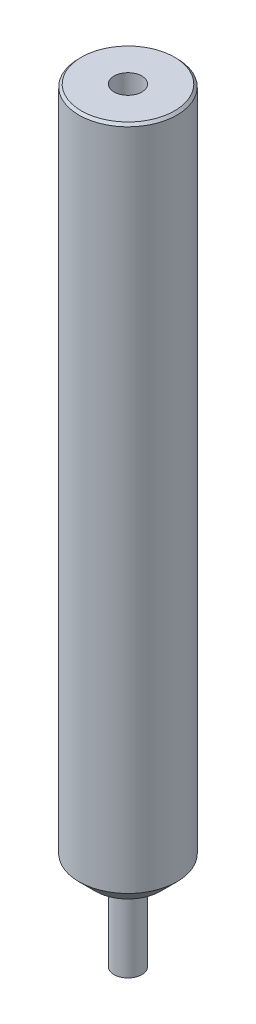
ISO-10303-21;
HEADER;
FILE_DESCRIPTION(('STEP AP214'),'2;1');
FILE_NAME('part.step','',(''),(''),'','','');
FILE_SCHEMA(('AUTOMOTIVE_DESIGN { 1 0 10303 214 1 1 1 1 }'));
ENDSEC;
DATA;
#1=APPLICATION_CONTEXT('core data for automotive mechanical design processes');
#2=APPLICATION_PROTOCOL_DEFINITION('international standard','automotive_design',2000,#1);
#3=PRODUCT_CONTEXT('',#1,'mechanical');
#4=PRODUCT('Part','Part','',(#3));
#5=PRODUCT_RELATED_PRODUCT_CATEGORY('part','',(#4));
#6=PRODUCT_DEFINITION_FORMATION('','',#4);
#7=PRODUCT_DEFINITION_CONTEXT('part definition',#1,'design');
#8=PRODUCT_DEFINITION('design','',#6,#7);
#9=PRODUCT_DEFINITION_SHAPE('','',#8);
#10=(LENGTH_UNIT() NAMED_UNIT(*) SI_UNIT(.MILLI.,.METRE.));
#11=(NAMED_UNIT(*) PLANE_ANGLE_UNIT() SI_UNIT($,.RADIAN.));
#12=(NAMED_UNIT(*) SI_UNIT($,.STERADIAN.) SOLID_ANGLE_UNIT());
#13=UNCERTAINTY_MEASURE_WITH_UNIT(LENGTH_MEASURE(1.E-05),#10,'distance_accuracy_value','');
#14=(GEOMETRIC_REPRESENTATION_CONTEXT(3) GLOBAL_UNCERTAINTY_ASSIGNED_CONTEXT((#13)) GLOBAL_UNIT_ASSIGNED_CONTEXT((#10,
#11,#12)) REPRESENTATION_CONTEXT('',''));
#15=CARTESIAN_POINT('',(0.,0.,0.));
#16=DIRECTION('',(0.,0.,1.));
#17=DIRECTION('',(1.,0.,0.));
#18=AXIS2_PLACEMENT_3D('',#15,#16,#17);
#19=CARTESIAN_POINT('',(4.27446189366745E-11,5.00249648859584E-12,0.));
#20=DIRECTION('',(0.,1.,0.));
#21=DIRECTION('',(0.,0.,1.));
#22=AXIS2_PLACEMENT_3D('',#19,#20,#21);
#23=CYLINDRICAL_SURFACE('',#22,1.7);
#24=CARTESIAN_POINT('',(4.27446189366745E-11,5.00249648859584E-12,0.));
#25=DIRECTION('',(0.,1.,0.));
#26=DIRECTION('',(0.,0.,1.));
#27=AXIS2_PLACEMENT_3D('',#24,#25,#26);
#28=CIRCLE('',#27,1.7);
#29=CARTESIAN_POINT('',(4.27446189366745E-11,5.00249648859584E-12,1.7));
#30=VERTEX_POINT('',#29);
#31=EDGE_CURVE('E10',#30,#30,#28,.T.);
#32=ORIENTED_EDGE('',*,*,#31,.T.);
#33=EDGE_LOOP('',(#32));
#34=FACE_BOUND('',#33,.T.);
#35=CARTESIAN_POINT('',(4.27446189366745E-11,10.000000000005,0.));
#36=DIRECTION('',(0.,1.,0.));
#37=DIRECTION('',(0.,0.,1.));
#38=AXIS2_PLACEMENT_3D('',#35,#36,#37);
#39=CIRCLE('',#38,1.7);
#40=CARTESIAN_POINT('',(4.27446189366745E-11,10.000000000005,1.7));
#41=VERTEX_POINT('',#40);
#42=EDGE_CURVE('E59',#41,#41,#39,.T.);
#43=ORIENTED_EDGE('',*,*,#42,.F.);
#44=EDGE_LOOP('',(#43));
#45=FACE_BOUND('',#44,.T.);
#46=ADVANCED_FACE('F31',(#34,#45),#23,.T.);
#47=CARTESIAN_POINT('',(1.70000000004274,5.00249648859584E-12,0.));
#48=DIRECTION('',(0.,-1.,0.));
#49=DIRECTION('',(0.,0.,-1.));
#50=AXIS2_PLACEMENT_3D('',#47,#48,#49);
#51=PLANE('',#50);
#52=ORIENTED_EDGE('',*,*,#31,.F.);
#53=EDGE_LOOP('',(#52));
#54=FACE_BOUND('',#53,.T.);
#55=ADVANCED_FACE('F67',(#54),#51,.T.);
#56=CARTESIAN_POINT('',(4.27446189366745E-11,83.600000000005,0.));
#57=DIRECTION('',(0.,1.,0.));
#58=DIRECTION('',(0.,0.,1.));
#59=AXIS2_PLACEMENT_3D('',#56,#57,#58);
#60=PLANE('',#59);
#61=CARTESIAN_POINT('',(4.27446189366745E-11,83.600000000005,0.));
#62=DIRECTION('',(0.,1.,0.));
#63=DIRECTION('',(0.,0.,1.));
#64=AXIS2_PLACEMENT_3D('',#61,#62,#63);
#65=CIRCLE('',#64,1.70000000000001);
#66=CARTESIAN_POINT('',(4.27446189366745E-11,83.600000000005,1.70000000000001));
#67=VERTEX_POINT('',#66);
#68=EDGE_CURVE('E37',#67,#67,#65,.T.);
#69=ORIENTED_EDGE('',*,*,#68,.T.);
#70=EDGE_LOOP('',(#69));
#71=FACE_BOUND('',#70,.T.);
#72=ADVANCED_FACE('F71',(#71),#60,.T.);
#73=CARTESIAN_POINT('',(4.27446189366745E-11,5.00249648859584E-12,0.));
#74=DIRECTION('',(0.,1.,0.));
#75=DIRECTION('',(0.,0.,1.));
#76=AXIS2_PLACEMENT_3D('',#73,#74,#75);
#77=CYLINDRICAL_SURFACE('',#76,1.70000000000001);
#78=CARTESIAN_POINT('',(4.27446189366745E-11,93.6000000000521,0.));
#79=DIRECTION('',(0.,1.,0.));
#80=DIRECTION('',(0.,0.,1.));
#81=AXIS2_PLACEMENT_3D('',#78,#79,#80);
#82=CIRCLE('',#81,1.70000000000001);
#83=CARTESIAN_POINT('',(4.27446189366745E-11,93.6000000000521,1.70000000000001));
#84=VERTEX_POINT('',#83);
#85=EDGE_CURVE('E41',#84,#84,#82,.T.);
#86=ORIENTED_EDGE('',*,*,#85,.T.);
#87=EDGE_LOOP('',(#86));
#88=FACE_BOUND('',#87,.T.);
#89=ORIENTED_EDGE('',*,*,#68,.F.);
#90=EDGE_LOOP('',(#89));
#91=FACE_BOUND('',#90,.T.);
#92=ADVANCED_FACE('F76',(#88,#91),#77,.F.);
#93=CARTESIAN_POINT('',(1.70000000004275,93.6000000000521,0.));
#94=DIRECTION('',(0.,1.,0.));
#95=DIRECTION('',(0.,0.,1.));
#96=AXIS2_PLACEMENT_3D('',#93,#94,#95);
#97=PLANE('',#96);
#98=CARTESIAN_POINT('',(4.27446189366745E-11,93.6000000000521,0.));
#99=DIRECTION('',(0.,1.,0.));
#100=DIRECTION('',(0.,0.,1.));
#101=AXIS2_PLACEMENT_3D('',#98,#99,#100);
#102=CIRCLE('',#101,5.69999999990514);
#103=CARTESIAN_POINT('',(4.27446189366745E-11,93.6000000000521,5.69999999990514));
#104=VERTEX_POINT('',#103);
#105=EDGE_CURVE('E45',#104,#104,#102,.T.);
#106=ORIENTED_EDGE('',*,*,#105,.T.);
#107=EDGE_LOOP('',(#106));
#108=FACE_BOUND('',#107,.T.);
#109=ORIENTED_EDGE('',*,*,#85,.F.);
#110=EDGE_LOOP('',(#109));
#111=FACE_BOUND('',#110,.T.);
#112=ADVANCED_FACE('F81',(#108,#111),#97,.T.);
#113=CARTESIAN_POINT('',(4.27446189366745E-11,93.6000000000521,0.));
#114=DIRECTION('',(0.,-1.,0.));
#115=DIRECTION('',(0.,0.,-1.));
#116=AXIS2_PLACEMENT_3D('',#113,#114,#115);
#117=CONICAL_SURFACE('',#116,5.69999999990514,0.78539816339744);
#118=CARTESIAN_POINT('',(4.27446189366745E-11,93.3,0.));
#119=DIRECTION('',(0.,1.,0.));
#120=DIRECTION('',(0.,0.,1.));
#121=AXIS2_PLACEMENT_3D('',#118,#119,#120);
#122=CIRCLE('',#121,5.99999999995726);
#123=CARTESIAN_POINT('',(4.27446189366745E-11,93.3,5.99999999995726));
#124=VERTEX_POINT('',#123);
#125=EDGE_CURVE('E50',#124,#124,#122,.T.);
#126=ORIENTED_EDGE('',*,*,#125,.T.);
#127=EDGE_LOOP('',(#126));
#128=FACE_BOUND('',#127,.T.);
#129=ORIENTED_EDGE('',*,*,#105,.F.);
#130=EDGE_LOOP('',(#129));
#131=FACE_BOUND('',#130,.T.);
#132=ADVANCED_FACE('F85',(#128,#131),#117,.T.);
#133=CARTESIAN_POINT('',(4.27446189366745E-11,5.00249648859584E-12,0.));
#134=DIRECTION('',(0.,1.,0.));
#135=DIRECTION('',(0.,0.,1.));
#136=AXIS2_PLACEMENT_3D('',#133,#134,#135);
#137=CYLINDRICAL_SURFACE('',#136,5.99999999995726);
#138=CARTESIAN_POINT('',(4.27446189366745E-11,12.,0.));
#139=DIRECTION('',(0.,1.,0.));
#140=DIRECTION('',(0.,0.,1.));
#141=AXIS2_PLACEMENT_3D('',#138,#139,#140);
#142=CIRCLE('',#141,5.99999999995726);
#143=CARTESIAN_POINT('',(4.27446189366745E-11,12.,5.99999999995726));
#144=VERTEX_POINT('',#143);
#145=EDGE_CURVE('E53',#144,#144,#142,.T.);
#146=ORIENTED_EDGE('',*,*,#145,.T.);
#147=EDGE_LOOP('',(#146));
#148=FACE_BOUND('',#147,.T.);
#149=ORIENTED_EDGE('',*,*,#125,.F.);
#150=EDGE_LOOP('',(#149));
#151=FACE_BOUND('',#150,.T.);
#152=ADVANCED_FACE('F89',(#148,#151),#137,.T.);
#153=CARTESIAN_POINT('',(4.27446189366745E-11,12.,0.));
#154=DIRECTION('',(0.,1.,0.));
#155=DIRECTION('',(0.,0.,1.));
#156=AXIS2_PLACEMENT_3D('',#153,#154,#155);
#157=CONICAL_SURFACE('',#156,5.99999999995726,0.785398163397448);
#158=CARTESIAN_POINT('',(4.27446189366745E-11,10.000000000005,0.));
#159=DIRECTION('',(0.,1.,0.));
#160=DIRECTION('',(0.,0.,1.));
#161=AXIS2_PLACEMENT_3D('',#158,#159,#160);
#162=CIRCLE('',#161,3.99999999996226);
#163=CARTESIAN_POINT('',(4.27446189366745E-11,10.000000000005,3.99999999996226));
#164=VERTEX_POINT('',#163);
#165=EDGE_CURVE('E56',#164,#164,#162,.T.);
#166=ORIENTED_EDGE('',*,*,#165,.T.);
#167=EDGE_LOOP('',(#166));
#168=FACE_BOUND('',#167,.T.);
#169=ORIENTED_EDGE('',*,*,#145,.F.);
#170=EDGE_LOOP('',(#169));
#171=FACE_BOUND('',#170,.T.);
#172=ADVANCED_FACE('F93',(#168,#171),#157,.T.);
#173=CARTESIAN_POINT('',(4.000000000005,10.000000000005,0.));
#174=DIRECTION('',(0.,-1.,0.));
#175=DIRECTION('',(0.,0.,-1.));
#176=AXIS2_PLACEMENT_3D('',#173,#174,#175);
#177=PLANE('',#176);
#178=ORIENTED_EDGE('',*,*,#42,.T.);
#179=EDGE_LOOP('',(#178));
#180=FACE_BOUND('',#179,.T.);
#181=ORIENTED_EDGE('',*,*,#165,.F.);
#182=EDGE_LOOP('',(#181));
#183=FACE_BOUND('',#182,.T.);
#184=ADVANCED_FACE('F63',(#180,#183),#177,.T.);
#185=CLOSED_SHELL('',(#46,#55,#72,#92,#112,#132,#152,#172,#184));
#186=MANIFOLD_SOLID_BREP('B2',#185);
#187=ADVANCED_BREP_SHAPE_REPRESENTATION('',(#18,#186),#14);
#188=SHAPE_DEFINITION_REPRESENTATION(#9,#187);
ENDSEC;
END-ISO-10303-21;
